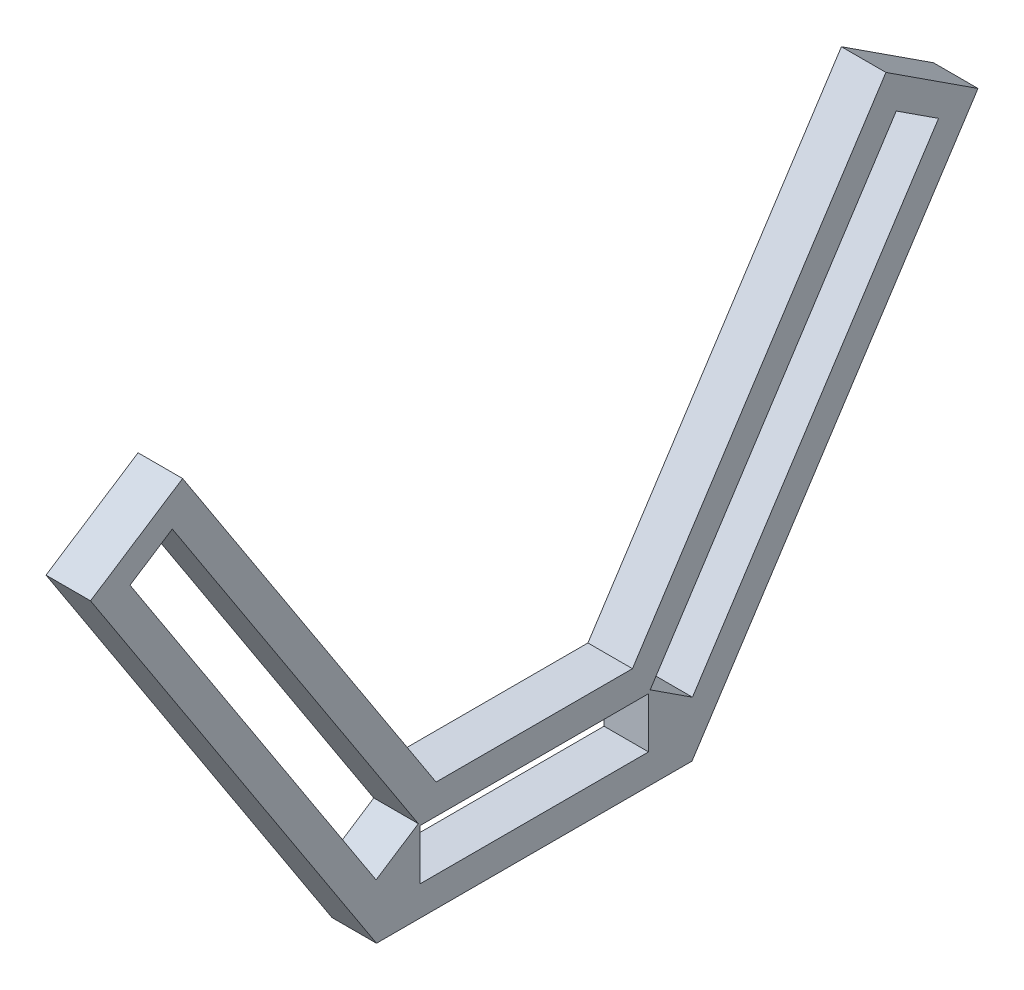
ISO-10303-21;
HEADER;
FILE_DESCRIPTION(('STEP AP214'),'2;1');
FILE_NAME('part.step','',(''),(''),'','','');
FILE_SCHEMA(('AUTOMOTIVE_DESIGN { 1 0 10303 214 1 1 1 1 }'));
ENDSEC;
DATA;
#1=APPLICATION_CONTEXT('core data for automotive mechanical design processes');
#2=APPLICATION_PROTOCOL_DEFINITION('international standard','automotive_design',2000,#1);
#3=PRODUCT_CONTEXT('',#1,'mechanical');
#4=PRODUCT('Part','Part','',(#3));
#5=PRODUCT_RELATED_PRODUCT_CATEGORY('part','',(#4));
#6=PRODUCT_DEFINITION_FORMATION('','',#4);
#7=PRODUCT_DEFINITION_CONTEXT('part definition',#1,'design');
#8=PRODUCT_DEFINITION('design','',#6,#7);
#9=PRODUCT_DEFINITION_SHAPE('','',#8);
#10=(LENGTH_UNIT() NAMED_UNIT(*) SI_UNIT(.MILLI.,.METRE.));
#11=(NAMED_UNIT(*) PLANE_ANGLE_UNIT() SI_UNIT($,.RADIAN.));
#12=(NAMED_UNIT(*) SI_UNIT($,.STERADIAN.) SOLID_ANGLE_UNIT());
#13=UNCERTAINTY_MEASURE_WITH_UNIT(LENGTH_MEASURE(1.E-05),#10,'distance_accuracy_value','');
#14=(GEOMETRIC_REPRESENTATION_CONTEXT(3) GLOBAL_UNCERTAINTY_ASSIGNED_CONTEXT((#13)) GLOBAL_UNIT_ASSIGNED_CONTEXT((#10,
#11,#12)) REPRESENTATION_CONTEXT('',''));
#15=CARTESIAN_POINT('',(0.,0.,0.));
#16=DIRECTION('',(0.,0.,1.));
#17=DIRECTION('',(1.,0.,0.));
#18=AXIS2_PLACEMENT_3D('',#15,#16,#17);
#19=CARTESIAN_POINT('',(3.,0.,0.));
#20=DIRECTION('',(1.,0.,0.));
#21=DIRECTION('',(0.,0.,-1.));
#22=AXIS2_PLACEMENT_3D('',#19,#20,#21);
#23=PLANE('',#22);
#24=DIRECTION('',(0.,0.,-1.));
#25=VECTOR('',#24,1.);
#26=CARTESIAN_POINT('',(3.,-7.41297177261392,16.1291077018014));
#27=LINE('',#26,#25);
#28=CARTESIAN_POINT('',(3.,-7.41297177261392,16.1291077018014));
#29=VERTEX_POINT('',#28);
#30=CARTESIAN_POINT('',(3.,-7.41297177261392,-5.12910770180139));
#31=VERTEX_POINT('',#30);
#32=EDGE_CURVE('E365',#29,#31,#27,.T.);
#33=ORIENTED_EDGE('',*,*,#32,.T.);
#34=DIRECTION('',(0.,-0.83822570686827,0.545323449289675));
#35=VECTOR('',#34,1.);
#36=CARTESIAN_POINT('',(3.,-6.63416981251471,-5.63577191850931));
#37=LINE('',#36,#35);
#38=CARTESIAN_POINT('',(3.,22.2007945037538,-24.3948985740741));
#39=VERTEX_POINT('',#38);
#40=EDGE_CURVE('E262',#39,#31,#37,.T.);
#41=ORIENTED_EDGE('',*,*,#40,.F.);
#42=DIRECTION('',(0.,-0.545323449289675,-0.83822570686827));
#43=VECTOR('',#42,1.);
#44=CARTESIAN_POINT('',(3.,26.2361880284974,-18.1920283432489));
#45=LINE('',#44,#43);
#46=CARTESIAN_POINT('',(3.,26.2361880284974,-18.1920283432489));
#47=VERTEX_POINT('',#46);
#48=EDGE_CURVE('E257',#47,#39,#45,.T.);
#49=ORIENTED_EDGE('',*,*,#48,.F.);
#50=DIRECTION('',(0.,0.83822570686827,-0.545323449289675));
#51=VECTOR('',#50,1.);
#52=CARTESIAN_POINT('',(3.,-0.0129717726139243,-1.11514529562912));
#53=LINE('',#52,#51);
#54=CARTESIAN_POINT('',(3.,-0.0129717726139243,-1.11514529562912));
#55=VERTEX_POINT('',#54);
#56=EDGE_CURVE('E253',#55,#47,#53,.T.);
#57=ORIENTED_EDGE('',*,*,#56,.F.);
#58=DIRECTION('',(0.,0.,1.));
#59=VECTOR('',#58,1.);
#60=CARTESIAN_POINT('',(3.,-0.0129717726139258,12.1151452956291));
#61=LINE('',#60,#59);
#62=CARTESIAN_POINT('',(3.,-0.0129717726139258,12.1151452956291));
#63=VERTEX_POINT('',#62);
#64=EDGE_CURVE('E368',#55,#63,#61,.T.);
#65=ORIENTED_EDGE('',*,*,#64,.T.);
#66=DIRECTION('',(0.,0.83822570686827,0.545323449289675));
#67=VECTOR('',#66,1.);
#68=CARTESIAN_POINT('',(3.,-0.0129717726139258,12.1151452956291));
#69=LINE('',#68,#67);
#70=CARTESIAN_POINT('',(3.,26.2361880284974,29.1920283432489));
#71=VERTEX_POINT('',#70);
#72=EDGE_CURVE('E354',#63,#71,#69,.T.);
#73=ORIENTED_EDGE('',*,*,#72,.T.);
#74=DIRECTION('',(0.,-0.545323449289675,0.83822570686827));
#75=VECTOR('',#74,1.);
#76=CARTESIAN_POINT('',(3.,26.2361880284974,29.1920283432489));
#77=LINE('',#76,#75);
#78=CARTESIAN_POINT('',(3.,22.2007945037538,35.3948985740741));
#79=VERTEX_POINT('',#78);
#80=EDGE_CURVE('E358',#71,#79,#77,.T.);
#81=ORIENTED_EDGE('',*,*,#80,.T.);
#82=DIRECTION('',(0.,-0.83822570686827,-0.545323449289675));
#83=VECTOR('',#82,1.);
#84=CARTESIAN_POINT('',(3.,-6.63416981251471,16.6357719185093));
#85=LINE('',#84,#83);
#86=EDGE_CURVE('E362',#79,#29,#85,.T.);
#87=ORIENTED_EDGE('',*,*,#86,.T.);
#88=EDGE_LOOP('',(#33,#41,#49,#57,#65,#73,#81,#87));
#89=FACE_BOUND('',#88,.T.);
#90=DIRECTION('',(0.,-1.,0.));
#91=VECTOR('',#90,1.);
#92=CARTESIAN_POINT('',(3.,-2.01297177261392,-2.2));
#93=LINE('',#92,#91);
#94=CARTESIAN_POINT('',(3.,-2.01297177261392,-2.2));
#95=VERTEX_POINT('',#94);
#96=CARTESIAN_POINT('',(3.,-5.41297177261392,-2.2));
#97=VERTEX_POINT('',#96);
#98=EDGE_CURVE('E237',#95,#97,#93,.T.);
#99=ORIENTED_EDGE('',*,*,#98,.T.);
#100=DIRECTION('',(0.,0.,-1.));
#101=VECTOR('',#100,1.);
#102=CARTESIAN_POINT('',(3.,-5.41297177261392,13.2));
#103=LINE('',#102,#101);
#104=CARTESIAN_POINT('',(3.,-5.41297177261392,13.2));
#105=VERTEX_POINT('',#104);
#106=EDGE_CURVE('E335',#105,#97,#103,.T.);
#107=ORIENTED_EDGE('',*,*,#106,.F.);
#108=DIRECTION('',(0.,-1.,0.));
#109=VECTOR('',#108,1.);
#110=CARTESIAN_POINT('',(3.,-2.01297177261393,13.2));
#111=LINE('',#110,#109);
#112=CARTESIAN_POINT('',(3.,-2.01297177261393,13.2));
#113=VERTEX_POINT('',#112);
#114=EDGE_CURVE('E331',#113,#105,#111,.T.);
#115=ORIENTED_EDGE('',*,*,#114,.F.);
#116=DIRECTION('',(0.,0.,1.));
#117=VECTOR('',#116,1.);
#118=CARTESIAN_POINT('',(3.,-2.01297177261393,13.2));
#119=LINE('',#118,#117);
#120=EDGE_CURVE('E328',#95,#113,#119,.T.);
#121=ORIENTED_EDGE('',*,*,#120,.F.);
#122=EDGE_LOOP('',(#99,#107,#115,#121));
#123=FACE_BOUND('',#122,.T.);
#124=DIRECTION('',(0.,0.83822570686827,0.545323449289675));
#125=VECTOR('',#124,1.);
#126=CARTESIAN_POINT('',(3.,-1.84532663124027,13.3090646898579));
#127=LINE('',#126,#125);
#128=CARTESIAN_POINT('',(3.,-1.84532663124027,13.3090646898579));
#129=VERTEX_POINT('',#128);
#130=CARTESIAN_POINT('',(3.,23.6367348575551,29.8868975482641));
#131=VERTEX_POINT('',#130);
#132=EDGE_CURVE('E293',#129,#131,#127,.T.);
#133=ORIENTED_EDGE('',*,*,#132,.F.);
#134=DIRECTION('',(0.,0.545323449289675,-0.83822570686827));
#135=VECTOR('',#134,1.);
#136=CARTESIAN_POINT('',(3.,-3.69942635882517,16.1590320932101));
#137=LINE('',#136,#135);
#138=CARTESIAN_POINT('',(3.,-3.69942635882517,16.1590320932101));
#139=VERTEX_POINT('',#138);
#140=EDGE_CURVE('E290',#139,#129,#137,.T.);
#141=ORIENTED_EDGE('',*,*,#140,.F.);
#142=DIRECTION('',(0.,-0.83822570686827,-0.545323449289675));
#143=VECTOR('',#142,1.);
#144=CARTESIAN_POINT('',(3.,-3.69942635882517,16.1590320932101));
#145=LINE('',#144,#143);
#146=CARTESIAN_POINT('',(3.,21.7826351299703,32.7368649516162));
#147=VERTEX_POINT('',#146);
#148=EDGE_CURVE('E300',#147,#139,#145,.T.);
#149=ORIENTED_EDGE('',*,*,#148,.F.);
#150=DIRECTION('',(0.,-0.545323449289675,0.83822570686827));
#151=VECTOR('',#150,1.);
#152=CARTESIAN_POINT('',(3.,23.6367348575551,29.8868975482641));
#153=LINE('',#152,#151);
#154=EDGE_CURVE('E297',#131,#147,#153,.T.);
#155=ORIENTED_EDGE('',*,*,#154,.F.);
#156=EDGE_LOOP('',(#133,#141,#149,#155));
#157=FACE_BOUND('',#156,.T.);
#158=DIRECTION('',(0.,0.83822570686827,-0.545323449289675));
#159=VECTOR('',#158,1.);
#160=CARTESIAN_POINT('',(3.,-1.84532663124027,-2.30906468985794));
#161=LINE('',#160,#159);
#162=CARTESIAN_POINT('',(3.,-1.84532663124027,-2.30906468985794));
#163=VERTEX_POINT('',#162);
#164=CARTESIAN_POINT('',(3.,23.6367348575551,-18.8868975482641));
#165=VERTEX_POINT('',#164);
#166=EDGE_CURVE('E201',#163,#165,#161,.T.);
#167=ORIENTED_EDGE('',*,*,#166,.T.);
#168=DIRECTION('',(0.,-0.545323449289675,-0.83822570686827));
#169=VECTOR('',#168,1.);
#170=CARTESIAN_POINT('',(3.,23.6367348575551,-18.8868975482641));
#171=LINE('',#170,#169);
#172=CARTESIAN_POINT('',(3.,21.7826351299703,-21.7368649516162));
#173=VERTEX_POINT('',#172);
#174=EDGE_CURVE('E210',#165,#173,#171,.T.);
#175=ORIENTED_EDGE('',*,*,#174,.T.);
#176=DIRECTION('',(0.,-0.83822570686827,0.545323449289675));
#177=VECTOR('',#176,1.);
#178=CARTESIAN_POINT('',(3.,-3.69942635882517,-5.15903209321006));
#179=LINE('',#178,#177);
#180=CARTESIAN_POINT('',(3.,-3.69942635882517,-5.15903209321006));
#181=VERTEX_POINT('',#180);
#182=EDGE_CURVE('E203',#173,#181,#179,.T.);
#183=ORIENTED_EDGE('',*,*,#182,.T.);
#184=DIRECTION('',(0.,0.545323449289675,0.83822570686827));
#185=VECTOR('',#184,1.);
#186=CARTESIAN_POINT('',(3.,-3.69942635882517,-5.15903209321006));
#187=LINE('',#186,#185);
#188=EDGE_CURVE('E186',#181,#163,#187,.T.);
#189=ORIENTED_EDGE('',*,*,#188,.T.);
#190=EDGE_LOOP('',(#167,#175,#183,#189));
#191=FACE_BOUND('',#190,.T.);
#192=ADVANCED_FACE('F43',(#89,#123,#157,#191),#23,.T.);
#193=CARTESIAN_POINT('',(0.,0.,0.));
#194=DIRECTION('',(1.,0.,0.));
#195=DIRECTION('',(0.,0.,-1.));
#196=AXIS2_PLACEMENT_3D('',#193,#194,#195);
#197=PLANE('',#196);
#198=DIRECTION('',(0.,-0.838225706868271,0.545323449289674));
#199=VECTOR('',#198,1.);
#200=CARTESIAN_POINT('',(0.,-6.63416981251471,-5.63577191850931));
#201=LINE('',#200,#199);
#202=CARTESIAN_POINT('',(0.,22.2007945037538,-24.3948985740741));
#203=VERTEX_POINT('',#202);
#204=CARTESIAN_POINT('',(0.,-7.41297177261392,-5.12910770180139));
#205=VERTEX_POINT('',#204);
#206=EDGE_CURVE('E258',#203,#205,#201,.T.);
#207=ORIENTED_EDGE('',*,*,#206,.T.);
#208=DIRECTION('',(0.,0.,-1.));
#209=VECTOR('',#208,1.);
#210=CARTESIAN_POINT('',(0.,-7.41297177261392,15.2));
#211=LINE('',#210,#209);
#212=CARTESIAN_POINT('',(0.,-7.41297177261392,16.1291077018014));
#213=VERTEX_POINT('',#212);
#214=EDGE_CURVE('E383',#213,#205,#211,.T.);
#215=ORIENTED_EDGE('',*,*,#214,.F.);
#216=DIRECTION('',(0.,-0.838225706868271,-0.545323449289674));
#217=VECTOR('',#216,1.);
#218=CARTESIAN_POINT('',(0.,-6.63416981251471,16.6357719185093));
#219=LINE('',#218,#217);
#220=CARTESIAN_POINT('',(0.,22.2007945037538,35.3948985740741));
#221=VERTEX_POINT('',#220);
#222=EDGE_CURVE('E379',#221,#213,#219,.T.);
#223=ORIENTED_EDGE('',*,*,#222,.F.);
#224=DIRECTION('',(0.,-0.545323449289675,0.83822570686827));
#225=VECTOR('',#224,1.);
#226=CARTESIAN_POINT('',(0.,26.2361880284974,29.1920283432489));
#227=LINE('',#226,#225);
#228=CARTESIAN_POINT('',(0.,26.2361880284974,29.1920283432489));
#229=VERTEX_POINT('',#228);
#230=EDGE_CURVE('E375',#229,#221,#227,.T.);
#231=ORIENTED_EDGE('',*,*,#230,.F.);
#232=DIRECTION('',(0.,0.83822570686827,0.545323449289675));
#233=VECTOR('',#232,1.);
#234=CARTESIAN_POINT('',(0.,-0.0129717726139258,12.1151452956291));
#235=LINE('',#234,#233);
#236=CARTESIAN_POINT('',(0.,-0.0129717726139258,12.1151452956291));
#237=VERTEX_POINT('',#236);
#238=EDGE_CURVE('E353',#237,#229,#235,.T.);
#239=ORIENTED_EDGE('',*,*,#238,.F.);
#240=DIRECTION('',(0.,0.,1.));
#241=VECTOR('',#240,1.);
#242=CARTESIAN_POINT('',(0.,-0.0129717726139258,12.1151452956291));
#243=LINE('',#242,#241);
#244=CARTESIAN_POINT('',(0.,-0.0129717726139243,-1.11514529562912));
#245=VERTEX_POINT('',#244);
#246=EDGE_CURVE('E359',#245,#237,#243,.T.);
#247=ORIENTED_EDGE('',*,*,#246,.F.);
#248=DIRECTION('',(0.,0.83822570686827,-0.545323449289675));
#249=VECTOR('',#248,1.);
#250=CARTESIAN_POINT('',(0.,-0.0129717726139243,-1.11514529562912));
#251=LINE('',#250,#249);
#252=CARTESIAN_POINT('',(0.,26.2361880284974,-18.1920283432489));
#253=VERTEX_POINT('',#252);
#254=EDGE_CURVE('E252',#245,#253,#251,.T.);
#255=ORIENTED_EDGE('',*,*,#254,.T.);
#256=DIRECTION('',(0.,-0.545323449289675,-0.83822570686827));
#257=VECTOR('',#256,1.);
#258=CARTESIAN_POINT('',(0.,26.2361880284974,-18.1920283432489));
#259=LINE('',#258,#257);
#260=EDGE_CURVE('E270',#253,#203,#259,.T.);
#261=ORIENTED_EDGE('',*,*,#260,.T.);
#262=EDGE_LOOP('',(#207,#215,#223,#231,#239,#247,#255,#261));
#263=FACE_BOUND('',#262,.T.);
#264=DIRECTION('',(0.,0.,-1.));
#265=VECTOR('',#264,1.);
#266=CARTESIAN_POINT('',(0.,-5.41297177261392,13.2));
#267=LINE('',#266,#265);
#268=CARTESIAN_POINT('',(0.,-5.41297177261392,13.2));
#269=VERTEX_POINT('',#268);
#270=CARTESIAN_POINT('',(0.,-5.41297177261392,-2.2));
#271=VERTEX_POINT('',#270);
#272=EDGE_CURVE('E332',#269,#271,#267,.T.);
#273=ORIENTED_EDGE('',*,*,#272,.T.);
#274=DIRECTION('',(0.,-1.,0.));
#275=VECTOR('',#274,1.);
#276=CARTESIAN_POINT('',(0.,-2.01297177261392,-2.2));
#277=LINE('',#276,#275);
#278=CARTESIAN_POINT('',(0.,-2.01297177261392,-2.2));
#279=VERTEX_POINT('',#278);
#280=EDGE_CURVE('E195',#279,#271,#277,.T.);
#281=ORIENTED_EDGE('',*,*,#280,.F.);
#282=DIRECTION('',(0.,0.,1.));
#283=VECTOR('',#282,1.);
#284=CARTESIAN_POINT('',(0.,-2.01297177261393,13.2));
#285=LINE('',#284,#283);
#286=CARTESIAN_POINT('',(0.,-2.01297177261393,13.2));
#287=VERTEX_POINT('',#286);
#288=EDGE_CURVE('E327',#279,#287,#285,.T.);
#289=ORIENTED_EDGE('',*,*,#288,.T.);
#290=DIRECTION('',(0.,-1.,0.));
#291=VECTOR('',#290,1.);
#292=CARTESIAN_POINT('',(0.,-2.01297177261393,13.2));
#293=LINE('',#292,#291);
#294=EDGE_CURVE('E341',#287,#269,#293,.T.);
#295=ORIENTED_EDGE('',*,*,#294,.T.);
#296=EDGE_LOOP('',(#273,#281,#289,#295));
#297=FACE_BOUND('',#296,.T.);
#298=DIRECTION('',(0.,0.545323449289675,-0.83822570686827));
#299=VECTOR('',#298,1.);
#300=CARTESIAN_POINT('',(0.,-3.69942635882517,16.1590320932101));
#301=LINE('',#300,#299);
#302=CARTESIAN_POINT('',(0.,-3.69942635882517,16.1590320932101));
#303=VERTEX_POINT('',#302);
#304=CARTESIAN_POINT('',(0.,-1.84532663124027,13.3090646898579));
#305=VERTEX_POINT('',#304);
#306=EDGE_CURVE('E67',#303,#305,#301,.T.);
#307=ORIENTED_EDGE('',*,*,#306,.T.);
#308=DIRECTION('',(0.,0.83822570686827,0.545323449289675));
#309=VECTOR('',#308,1.);
#310=CARTESIAN_POINT('',(0.,-1.84532663124027,13.3090646898579));
#311=LINE('',#310,#309);
#312=CARTESIAN_POINT('',(0.,23.6367348575551,29.8868975482641));
#313=VERTEX_POINT('',#312);
#314=EDGE_CURVE('E306',#305,#313,#311,.T.);
#315=ORIENTED_EDGE('',*,*,#314,.T.);
#316=DIRECTION('',(0.,-0.545323449289675,0.83822570686827));
#317=VECTOR('',#316,1.);
#318=CARTESIAN_POINT('',(0.,23.6367348575551,29.8868975482641));
#319=LINE('',#318,#317);
#320=CARTESIAN_POINT('',(0.,21.7826351299702,32.7368649516162));
#321=VERTEX_POINT('',#320);
#322=EDGE_CURVE('E310',#313,#321,#319,.T.);
#323=ORIENTED_EDGE('',*,*,#322,.T.);
#324=DIRECTION('',(0.,-0.83822570686827,-0.545323449289675));
#325=VECTOR('',#324,1.);
#326=CARTESIAN_POINT('',(0.,-3.69942635882517,16.1590320932101));
#327=LINE('',#326,#325);
#328=EDGE_CURVE('E294',#321,#303,#327,.T.);
#329=ORIENTED_EDGE('',*,*,#328,.T.);
#330=EDGE_LOOP('',(#307,#315,#323,#329));
#331=FACE_BOUND('',#330,.T.);
#332=DIRECTION('',(0.,0.545323449289675,0.83822570686827));
#333=VECTOR('',#332,1.);
#334=CARTESIAN_POINT('',(0.,-3.69942635882517,-5.15903209321006));
#335=LINE('',#334,#333);
#336=CARTESIAN_POINT('',(0.,-3.69942635882517,-5.15903209321006));
#337=VERTEX_POINT('',#336);
#338=CARTESIAN_POINT('',(0.,-1.84532663124027,-2.30906468985794));
#339=VERTEX_POINT('',#338);
#340=EDGE_CURVE('E189',#337,#339,#335,.T.);
#341=ORIENTED_EDGE('',*,*,#340,.F.);
#342=DIRECTION('',(0.,-0.83822570686827,0.545323449289675));
#343=VECTOR('',#342,1.);
#344=CARTESIAN_POINT('',(0.,-3.69942635882517,-5.15903209321006));
#345=LINE('',#344,#343);
#346=CARTESIAN_POINT('',(0.,21.7826351299703,-21.7368649516162));
#347=VERTEX_POINT('',#346);
#348=EDGE_CURVE('E205',#347,#337,#345,.T.);
#349=ORIENTED_EDGE('',*,*,#348,.F.);
#350=DIRECTION('',(0.,-0.545323449289675,-0.83822570686827));
#351=VECTOR('',#350,1.);
#352=CARTESIAN_POINT('',(0.,23.6367348575551,-18.8868975482641));
#353=LINE('',#352,#351);
#354=CARTESIAN_POINT('',(0.,23.6367348575551,-18.8868975482641));
#355=VERTEX_POINT('',#354);
#356=EDGE_CURVE('E223',#355,#347,#353,.T.);
#357=ORIENTED_EDGE('',*,*,#356,.F.);
#358=DIRECTION('',(0.,0.83822570686827,-0.545323449289675));
#359=VECTOR('',#358,1.);
#360=CARTESIAN_POINT('',(0.,-1.84532663124027,-2.30906468985794));
#361=LINE('',#360,#359);
#362=EDGE_CURVE('E220',#339,#355,#361,.T.);
#363=ORIENTED_EDGE('',*,*,#362,.F.);
#364=EDGE_LOOP('',(#341,#349,#357,#363));
#365=FACE_BOUND('',#364,.T.);
#366=ADVANCED_FACE('F406',(#263,#297,#331,#365),#197,.F.);
#367=CARTESIAN_POINT('',(3.,-0.0129717726139258,12.1151452956291));
#368=DIRECTION('',(0.,-0.545323449289675,0.83822570686827));
#369=DIRECTION('',(0.,-0.83822570686827,-0.545323449289675));
#370=AXIS2_PLACEMENT_3D('',#367,#368,#369);
#371=PLANE('',#370);
#372=ORIENTED_EDGE('',*,*,#238,.T.);
#373=DIRECTION('',(-1.,0.,0.));
#374=VECTOR('',#373,1.);
#375=CARTESIAN_POINT('',(3.,26.2361880284974,29.1920283432489));
#376=LINE('',#375,#374);
#377=EDGE_CURVE('E11',#71,#229,#376,.T.);
#378=ORIENTED_EDGE('',*,*,#377,.F.);
#379=ORIENTED_EDGE('',*,*,#72,.F.);
#380=DIRECTION('',(-1.,0.,0.));
#381=VECTOR('',#380,1.);
#382=CARTESIAN_POINT('',(3.,-0.0129717726139258,12.1151452956291));
#383=LINE('',#382,#381);
#384=EDGE_CURVE('E371',#63,#237,#383,.T.);
#385=ORIENTED_EDGE('',*,*,#384,.T.);
#386=EDGE_LOOP('',(#372,#378,#379,#385));
#387=FACE_BOUND('',#386,.T.);
#388=ADVANCED_FACE('F45',(#387),#371,.F.);
#389=CARTESIAN_POINT('',(3.,26.2361880284974,29.1920283432489));
#390=DIRECTION('',(0.,-0.83822570686827,-0.545323449289675));
#391=DIRECTION('',(0.,0.545323449289675,-0.83822570686827));
#392=AXIS2_PLACEMENT_3D('',#389,#390,#391);
#393=PLANE('',#392);
#394=ORIENTED_EDGE('',*,*,#230,.T.);
#395=DIRECTION('',(-1.,0.,0.));
#396=VECTOR('',#395,1.);
#397=CARTESIAN_POINT('',(3.,22.2007945037538,35.3948985740741));
#398=LINE('',#397,#396);
#399=EDGE_CURVE('E52',#79,#221,#398,.T.);
#400=ORIENTED_EDGE('',*,*,#399,.F.);
#401=ORIENTED_EDGE('',*,*,#80,.F.);
#402=ORIENTED_EDGE('',*,*,#377,.T.);
#403=EDGE_LOOP('',(#394,#400,#401,#402));
#404=FACE_BOUND('',#403,.T.);
#405=ADVANCED_FACE('F402',(#404),#393,.F.);
#406=CARTESIAN_POINT('',(3.,-6.63416981251471,16.6357719185093));
#407=DIRECTION('',(0.,0.545323449289674,-0.838225706868271));
#408=DIRECTION('',(0.,0.838225706868271,0.545323449289674));
#409=AXIS2_PLACEMENT_3D('',#406,#407,#408);
#410=PLANE('',#409);
#411=ORIENTED_EDGE('',*,*,#222,.T.);
#412=DIRECTION('',(-1.,0.,0.));
#413=VECTOR('',#412,1.);
#414=CARTESIAN_POINT('',(3.,-7.41297177261392,16.1291077018014));
#415=LINE('',#414,#413);
#416=EDGE_CURVE('E391',#29,#213,#415,.T.);
#417=ORIENTED_EDGE('',*,*,#416,.F.);
#418=ORIENTED_EDGE('',*,*,#86,.F.);
#419=ORIENTED_EDGE('',*,*,#399,.T.);
#420=EDGE_LOOP('',(#411,#417,#418,#419));
#421=FACE_BOUND('',#420,.T.);
#422=ADVANCED_FACE('F399',(#421),#410,.F.);
#423=CARTESIAN_POINT('',(3.,-7.41297177261392,15.2));
#424=DIRECTION('',(0.,1.,0.));
#425=DIRECTION('',(0.,0.,1.));
#426=AXIS2_PLACEMENT_3D('',#423,#424,#425);
#427=PLANE('',#426);
#428=ORIENTED_EDGE('',*,*,#214,.T.);
#429=DIRECTION('',(-1.,0.,0.));
#430=VECTOR('',#429,1.);
#431=CARTESIAN_POINT('',(3.,-7.41297177261392,-5.12910770180139));
#432=LINE('',#431,#430);
#433=EDGE_CURVE('E280',#31,#205,#432,.T.);
#434=ORIENTED_EDGE('',*,*,#433,.F.);
#435=ORIENTED_EDGE('',*,*,#32,.F.);
#436=ORIENTED_EDGE('',*,*,#416,.T.);
#437=EDGE_LOOP('',(#428,#434,#435,#436));
#438=FACE_BOUND('',#437,.T.);
#439=ADVANCED_FACE('F411',(#438),#427,.F.);
#440=CARTESIAN_POINT('',(3.,-0.0129717726139258,12.1151452956291));
#441=DIRECTION('',(0.,-1.,0.));
#442=DIRECTION('',(0.,0.,-1.));
#443=AXIS2_PLACEMENT_3D('',#440,#441,#442);
#444=PLANE('',#443);
#445=ORIENTED_EDGE('',*,*,#64,.F.);
#446=DIRECTION('',(-1.,0.,0.));
#447=VECTOR('',#446,1.);
#448=CARTESIAN_POINT('',(3.,-0.0129717726139243,-1.11514529562912));
#449=LINE('',#448,#447);
#450=EDGE_CURVE('E266',#55,#245,#449,.T.);
#451=ORIENTED_EDGE('',*,*,#450,.T.);
#452=ORIENTED_EDGE('',*,*,#246,.T.);
#453=ORIENTED_EDGE('',*,*,#384,.F.);
#454=EDGE_LOOP('',(#445,#451,#452,#453));
#455=FACE_BOUND('',#454,.T.);
#456=ADVANCED_FACE('F424',(#455),#444,.F.);
#457=CARTESIAN_POINT('',(3.,-2.01297177261393,13.2));
#458=DIRECTION('',(0.,-1.,0.));
#459=DIRECTION('',(0.,0.,-1.));
#460=AXIS2_PLACEMENT_3D('',#457,#458,#459);
#461=PLANE('',#460);
#462=ORIENTED_EDGE('',*,*,#288,.F.);
#463=DIRECTION('',(-1.,0.,0.));
#464=VECTOR('',#463,1.);
#465=CARTESIAN_POINT('',(3.,-2.01297177261392,-2.2));
#466=LINE('',#465,#464);
#467=EDGE_CURVE('E248',#95,#279,#466,.T.);
#468=ORIENTED_EDGE('',*,*,#467,.F.);
#469=ORIENTED_EDGE('',*,*,#120,.T.);
#470=DIRECTION('',(-1.,0.,0.));
#471=VECTOR('',#470,1.);
#472=CARTESIAN_POINT('',(3.,-2.01297177261393,13.2));
#473=LINE('',#472,#471);
#474=EDGE_CURVE('E349',#113,#287,#473,.T.);
#475=ORIENTED_EDGE('',*,*,#474,.T.);
#476=EDGE_LOOP('',(#462,#468,#469,#475));
#477=FACE_BOUND('',#476,.T.);
#478=ADVANCED_FACE('F449',(#477),#461,.T.);
#479=CARTESIAN_POINT('',(3.,-2.01297177261393,13.2));
#480=DIRECTION('',(0.,0.,-1.));
#481=DIRECTION('',(-1.,0.,0.));
#482=AXIS2_PLACEMENT_3D('',#479,#480,#481);
#483=PLANE('',#482);
#484=ORIENTED_EDGE('',*,*,#294,.F.);
#485=ORIENTED_EDGE('',*,*,#474,.F.);
#486=ORIENTED_EDGE('',*,*,#114,.T.);
#487=DIRECTION('',(-1.,0.,0.));
#488=VECTOR('',#487,1.);
#489=CARTESIAN_POINT('',(3.,-5.41297177261392,13.2));
#490=LINE('',#489,#488);
#491=EDGE_CURVE('E338',#105,#269,#490,.T.);
#492=ORIENTED_EDGE('',*,*,#491,.T.);
#493=EDGE_LOOP('',(#484,#485,#486,#492));
#494=FACE_BOUND('',#493,.T.);
#495=ADVANCED_FACE('F494',(#494),#483,.T.);
#496=CARTESIAN_POINT('',(3.,-5.41297177261392,13.2));
#497=DIRECTION('',(0.,1.,0.));
#498=DIRECTION('',(0.,0.,1.));
#499=AXIS2_PLACEMENT_3D('',#496,#497,#498);
#500=PLANE('',#499);
#501=ORIENTED_EDGE('',*,*,#106,.T.);
#502=DIRECTION('',(-1.,0.,0.));
#503=VECTOR('',#502,1.);
#504=CARTESIAN_POINT('',(3.,-5.41297177261392,-2.2));
#505=LINE('',#504,#503);
#506=EDGE_CURVE('E241',#97,#271,#505,.T.);
#507=ORIENTED_EDGE('',*,*,#506,.T.);
#508=ORIENTED_EDGE('',*,*,#272,.F.);
#509=ORIENTED_EDGE('',*,*,#491,.F.);
#510=EDGE_LOOP('',(#501,#507,#508,#509));
#511=FACE_BOUND('',#510,.T.);
#512=ADVANCED_FACE('F502',(#511),#500,.T.);
#513=CARTESIAN_POINT('',(3.,-3.69942635882517,16.1590320932101));
#514=DIRECTION('',(0.,0.83822570686827,0.545323449289675));
#515=DIRECTION('',(0.,-0.545323449289675,0.83822570686827));
#516=AXIS2_PLACEMENT_3D('',#513,#514,#515);
#517=PLANE('',#516);
#518=ORIENTED_EDGE('',*,*,#306,.F.);
#519=DIRECTION('',(-1.,0.,0.));
#520=VECTOR('',#519,1.);
#521=CARTESIAN_POINT('',(3.,-3.69942635882517,16.1590320932101));
#522=LINE('',#521,#520);
#523=EDGE_CURVE('E303',#139,#303,#522,.T.);
#524=ORIENTED_EDGE('',*,*,#523,.F.);
#525=ORIENTED_EDGE('',*,*,#140,.T.);
#526=DIRECTION('',(-1.,0.,0.));
#527=VECTOR('',#526,1.);
#528=CARTESIAN_POINT('',(3.,-1.84532663124027,13.3090646898579));
#529=LINE('',#528,#527);
#530=EDGE_CURVE('E324',#129,#305,#529,.T.);
#531=ORIENTED_EDGE('',*,*,#530,.T.);
#532=EDGE_LOOP('',(#518,#524,#525,#531));
#533=FACE_BOUND('',#532,.T.);
#534=ADVANCED_FACE('F506',(#533),#517,.T.);
#535=CARTESIAN_POINT('',(3.,-1.84532663124027,13.3090646898579));
#536=DIRECTION('',(0.,-0.545323449289675,0.83822570686827));
#537=DIRECTION('',(0.,-0.83822570686827,-0.545323449289675));
#538=AXIS2_PLACEMENT_3D('',#535,#536,#537);
#539=PLANE('',#538);
#540=ORIENTED_EDGE('',*,*,#314,.F.);
#541=ORIENTED_EDGE('',*,*,#530,.F.);
#542=ORIENTED_EDGE('',*,*,#132,.T.);
#543=DIRECTION('',(-1.,0.,0.));
#544=VECTOR('',#543,1.);
#545=CARTESIAN_POINT('',(3.,23.6367348575551,29.8868975482641));
#546=LINE('',#545,#544);
#547=EDGE_CURVE('E321',#131,#313,#546,.T.);
#548=ORIENTED_EDGE('',*,*,#547,.T.);
#549=EDGE_LOOP('',(#540,#541,#542,#548));
#550=FACE_BOUND('',#549,.T.);
#551=ADVANCED_FACE('F607',(#550),#539,.T.);
#552=CARTESIAN_POINT('',(3.,23.6367348575551,29.8868975482641));
#553=DIRECTION('',(0.,-0.83822570686827,-0.545323449289675));
#554=DIRECTION('',(0.,0.545323449289675,-0.83822570686827));
#555=AXIS2_PLACEMENT_3D('',#552,#553,#554);
#556=PLANE('',#555);
#557=ORIENTED_EDGE('',*,*,#322,.F.);
#558=ORIENTED_EDGE('',*,*,#547,.F.);
#559=ORIENTED_EDGE('',*,*,#154,.T.);
#560=DIRECTION('',(-1.,0.,0.));
#561=VECTOR('',#560,1.);
#562=CARTESIAN_POINT('',(3.,21.7826351299702,32.7368649516162));
#563=LINE('',#562,#561);
#564=EDGE_CURVE('E59',#147,#321,#563,.T.);
#565=ORIENTED_EDGE('',*,*,#564,.T.);
#566=EDGE_LOOP('',(#557,#558,#559,#565));
#567=FACE_BOUND('',#566,.T.);
#568=ADVANCED_FACE('F598',(#567),#556,.T.);
#569=CARTESIAN_POINT('',(3.,-3.69942635882517,16.1590320932101));
#570=DIRECTION('',(0.,0.545323449289675,-0.83822570686827));
#571=DIRECTION('',(0.,0.83822570686827,0.545323449289675));
#572=AXIS2_PLACEMENT_3D('',#569,#570,#571);
#573=PLANE('',#572);
#574=ORIENTED_EDGE('',*,*,#328,.F.);
#575=ORIENTED_EDGE('',*,*,#564,.F.);
#576=ORIENTED_EDGE('',*,*,#148,.T.);
#577=ORIENTED_EDGE('',*,*,#523,.T.);
#578=EDGE_LOOP('',(#574,#575,#576,#577));
#579=FACE_BOUND('',#578,.T.);
#580=ADVANCED_FACE('F440',(#579),#573,.T.);
#581=CARTESIAN_POINT('',(3.,-0.0129717726139243,-1.11514529562912));
#582=DIRECTION('',(0.,-0.545323449289675,-0.83822570686827));
#583=DIRECTION('',(0.,-0.83822570686827,0.545323449289675));
#584=AXIS2_PLACEMENT_3D('',#581,#582,#583);
#585=PLANE('',#584);
#586=ORIENTED_EDGE('',*,*,#254,.F.);
#587=ORIENTED_EDGE('',*,*,#450,.F.);
#588=ORIENTED_EDGE('',*,*,#56,.T.);
#589=DIRECTION('',(-1.,0.,0.));
#590=VECTOR('',#589,1.);
#591=CARTESIAN_POINT('',(3.,26.2361880284974,-18.1920283432489));
#592=LINE('',#591,#590);
#593=EDGE_CURVE('E287',#47,#253,#592,.T.);
#594=ORIENTED_EDGE('',*,*,#593,.T.);
#595=EDGE_LOOP('',(#586,#587,#588,#594));
#596=FACE_BOUND('',#595,.T.);
#597=ADVANCED_FACE('F429',(#596),#585,.F.);
#598=CARTESIAN_POINT('',(3.,26.2361880284974,-18.1920283432489));
#599=DIRECTION('',(0.,-0.83822570686827,0.545323449289675));
#600=DIRECTION('',(0.,0.545323449289675,0.83822570686827));
#601=AXIS2_PLACEMENT_3D('',#598,#599,#600);
#602=PLANE('',#601);
#603=ORIENTED_EDGE('',*,*,#260,.F.);
#604=ORIENTED_EDGE('',*,*,#593,.F.);
#605=ORIENTED_EDGE('',*,*,#48,.T.);
#606=DIRECTION('',(-1.,0.,0.));
#607=VECTOR('',#606,1.);
#608=CARTESIAN_POINT('',(3.,22.2007945037538,-24.3948985740741));
#609=LINE('',#608,#607);
#610=EDGE_CURVE('E284',#39,#203,#609,.T.);
#611=ORIENTED_EDGE('',*,*,#610,.T.);
#612=EDGE_LOOP('',(#603,#604,#605,#611));
#613=FACE_BOUND('',#612,.T.);
#614=ADVANCED_FACE('F431',(#613),#602,.F.);
#615=CARTESIAN_POINT('',(3.,-6.63416981251471,-5.63577191850931));
#616=DIRECTION('',(0.,0.545323449289674,0.838225706868271));
#617=DIRECTION('',(0.,0.838225706868271,-0.545323449289674));
#618=AXIS2_PLACEMENT_3D('',#615,#616,#617);
#619=PLANE('',#618);
#620=ORIENTED_EDGE('',*,*,#206,.F.);
#621=ORIENTED_EDGE('',*,*,#610,.F.);
#622=ORIENTED_EDGE('',*,*,#40,.T.);
#623=ORIENTED_EDGE('',*,*,#433,.T.);
#624=EDGE_LOOP('',(#620,#621,#622,#623));
#625=FACE_BOUND('',#624,.T.);
#626=ADVANCED_FACE('F414',(#625),#619,.F.);
#627=CARTESIAN_POINT('',(3.,-2.01297177261392,-2.2));
#628=DIRECTION('',(0.,0.,1.));
#629=DIRECTION('',(-1.,0.,0.));
#630=AXIS2_PLACEMENT_3D('',#627,#628,#629);
#631=PLANE('',#630);
#632=ORIENTED_EDGE('',*,*,#280,.T.);
#633=ORIENTED_EDGE('',*,*,#506,.F.);
#634=ORIENTED_EDGE('',*,*,#98,.F.);
#635=ORIENTED_EDGE('',*,*,#467,.T.);
#636=EDGE_LOOP('',(#632,#633,#634,#635));
#637=FACE_BOUND('',#636,.T.);
#638=ADVANCED_FACE('F438',(#637),#631,.T.);
#639=CARTESIAN_POINT('',(3.,-3.69942635882517,-5.15903209321006));
#640=DIRECTION('',(0.,0.83822570686827,-0.545323449289675));
#641=DIRECTION('',(0.,-0.545323449289675,-0.83822570686827));
#642=AXIS2_PLACEMENT_3D('',#639,#640,#641);
#643=PLANE('',#642);
#644=ORIENTED_EDGE('',*,*,#340,.T.);
#645=DIRECTION('',(-1.,0.,0.));
#646=VECTOR('',#645,1.);
#647=CARTESIAN_POINT('',(3.,-1.84532663124027,-2.30906468985794));
#648=LINE('',#647,#646);
#649=EDGE_CURVE('E183',#163,#339,#648,.T.);
#650=ORIENTED_EDGE('',*,*,#649,.F.);
#651=ORIENTED_EDGE('',*,*,#188,.F.);
#652=DIRECTION('',(-1.,0.,0.));
#653=VECTOR('',#652,1.);
#654=CARTESIAN_POINT('',(3.,-3.69942635882517,-5.15903209321006));
#655=LINE('',#654,#653);
#656=EDGE_CURVE('E217',#181,#337,#655,.T.);
#657=ORIENTED_EDGE('',*,*,#656,.T.);
#658=EDGE_LOOP('',(#644,#650,#651,#657));
#659=FACE_BOUND('',#658,.T.);
#660=ADVANCED_FACE('F185',(#659),#643,.T.);
#661=CARTESIAN_POINT('',(3.,-1.84532663124027,-2.30906468985794));
#662=DIRECTION('',(0.,-0.545323449289675,-0.83822570686827));
#663=DIRECTION('',(0.,-0.83822570686827,0.545323449289675));
#664=AXIS2_PLACEMENT_3D('',#661,#662,#663);
#665=PLANE('',#664);
#666=ORIENTED_EDGE('',*,*,#362,.T.);
#667=DIRECTION('',(-1.,0.,0.));
#668=VECTOR('',#667,1.);
#669=CARTESIAN_POINT('',(3.,23.6367348575551,-18.8868975482641));
#670=LINE('',#669,#668);
#671=EDGE_CURVE('E196',#165,#355,#670,.T.);
#672=ORIENTED_EDGE('',*,*,#671,.F.);
#673=ORIENTED_EDGE('',*,*,#166,.F.);
#674=ORIENTED_EDGE('',*,*,#649,.T.);
#675=EDGE_LOOP('',(#666,#672,#673,#674));
#676=FACE_BOUND('',#675,.T.);
#677=ADVANCED_FACE('F207',(#676),#665,.T.);
#678=CARTESIAN_POINT('',(3.,23.6367348575551,-18.8868975482641));
#679=DIRECTION('',(0.,-0.83822570686827,0.545323449289675));
#680=DIRECTION('',(0.,0.545323449289675,0.83822570686827));
#681=AXIS2_PLACEMENT_3D('',#678,#679,#680);
#682=PLANE('',#681);
#683=ORIENTED_EDGE('',*,*,#356,.T.);
#684=DIRECTION('',(-1.,0.,0.));
#685=VECTOR('',#684,1.);
#686=CARTESIAN_POINT('',(3.,21.7826351299703,-21.7368649516162));
#687=LINE('',#686,#685);
#688=EDGE_CURVE('E232',#173,#347,#687,.T.);
#689=ORIENTED_EDGE('',*,*,#688,.F.);
#690=ORIENTED_EDGE('',*,*,#174,.F.);
#691=ORIENTED_EDGE('',*,*,#671,.T.);
#692=EDGE_LOOP('',(#683,#689,#690,#691));
#693=FACE_BOUND('',#692,.T.);
#694=ADVANCED_FACE('F557',(#693),#682,.T.);
#695=CARTESIAN_POINT('',(3.,-3.69942635882517,-5.15903209321006));
#696=DIRECTION('',(0.,0.545323449289675,0.83822570686827));
#697=DIRECTION('',(0.,0.83822570686827,-0.545323449289675));
#698=AXIS2_PLACEMENT_3D('',#695,#696,#697);
#699=PLANE('',#698);
#700=ORIENTED_EDGE('',*,*,#348,.T.);
#701=ORIENTED_EDGE('',*,*,#656,.F.);
#702=ORIENTED_EDGE('',*,*,#182,.F.);
#703=ORIENTED_EDGE('',*,*,#688,.T.);
#704=EDGE_LOOP('',(#700,#701,#702,#703));
#705=FACE_BOUND('',#704,.T.);
#706=ADVANCED_FACE('F567',(#705),#699,.T.);
#707=CLOSED_SHELL('',(#192,#366,#388,#405,#422,#439,#456,#478,#495,#512,#534,#551,#568,#580,
#597,#614,#626,#638,#660,#677,#694,#706));
#708=MANIFOLD_SOLID_BREP('B2',#707);
#709=ADVANCED_BREP_SHAPE_REPRESENTATION('',(#18,#708),#14);
#710=SHAPE_DEFINITION_REPRESENTATION(#9,#709);
ENDSEC;
END-ISO-10303-21;
